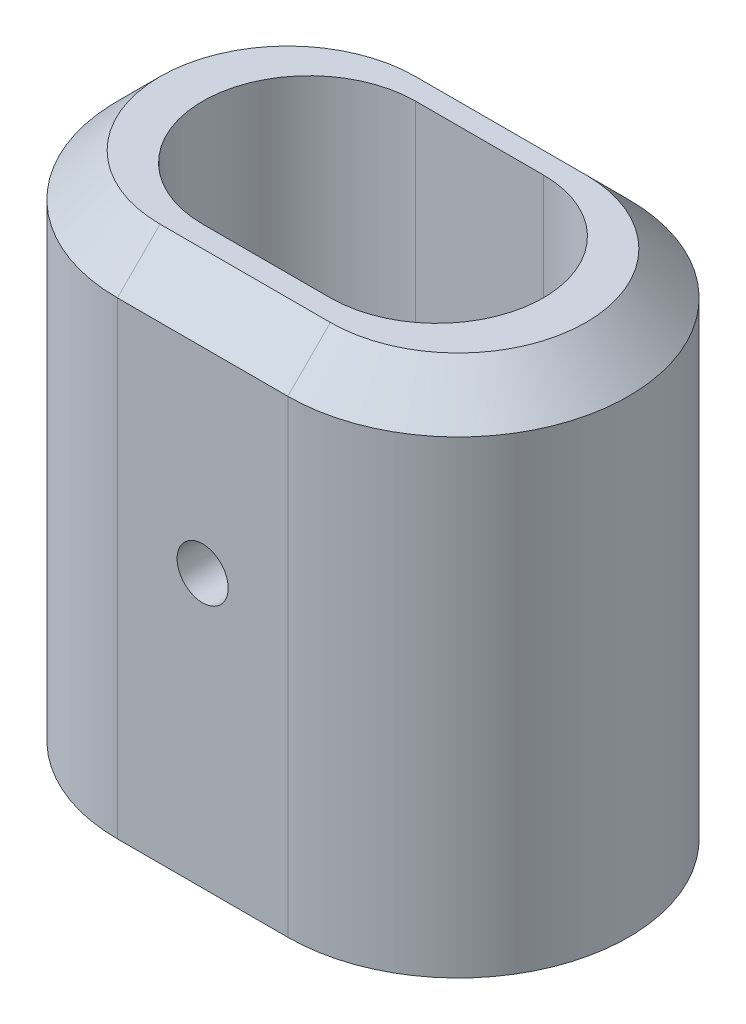
ISO-10303-21;
HEADER;
FILE_DESCRIPTION(('STEP AP214'),'2;1');
FILE_NAME('part.step','',(''),(''),'','','');
FILE_SCHEMA(('AUTOMOTIVE_DESIGN { 1 0 10303 214 1 1 1 1 }'));
ENDSEC;
DATA;
#1=APPLICATION_CONTEXT('core data for automotive mechanical design processes');
#2=APPLICATION_PROTOCOL_DEFINITION('international standard','automotive_design',2000,#1);
#3=PRODUCT_CONTEXT('',#1,'mechanical');
#4=PRODUCT('Part','Part','',(#3));
#5=PRODUCT_RELATED_PRODUCT_CATEGORY('part','',(#4));
#6=PRODUCT_DEFINITION_FORMATION('','',#4);
#7=PRODUCT_DEFINITION_CONTEXT('part definition',#1,'design');
#8=PRODUCT_DEFINITION('design','',#6,#7);
#9=PRODUCT_DEFINITION_SHAPE('','',#8);
#10=(LENGTH_UNIT() NAMED_UNIT(*) SI_UNIT(.MILLI.,.METRE.));
#11=(NAMED_UNIT(*) PLANE_ANGLE_UNIT() SI_UNIT($,.RADIAN.));
#12=(NAMED_UNIT(*) SI_UNIT($,.STERADIAN.) SOLID_ANGLE_UNIT());
#13=UNCERTAINTY_MEASURE_WITH_UNIT(LENGTH_MEASURE(1.E-05),#10,'distance_accuracy_value','');
#14=(GEOMETRIC_REPRESENTATION_CONTEXT(3) GLOBAL_UNCERTAINTY_ASSIGNED_CONTEXT((#13)) GLOBAL_UNIT_ASSIGNED_CONTEXT((#10,
#11,#12)) REPRESENTATION_CONTEXT('',''));
#15=CARTESIAN_POINT('',(0.,0.,0.));
#16=DIRECTION('',(0.,0.,1.));
#17=DIRECTION('',(1.,0.,0.));
#18=AXIS2_PLACEMENT_3D('',#15,#16,#17);
#19=CARTESIAN_POINT('',(0.,60.,0.));
#20=DIRECTION('',(0.,-1.,0.));
#21=DIRECTION('',(0.,0.,-1.));
#22=AXIS2_PLACEMENT_3D('',#19,#20,#21);
#23=CYLINDRICAL_SURFACE('',#22,20.);
#24=DIRECTION('',(0.,-1.,0.));
#25=VECTOR('',#24,1.);
#26=CARTESIAN_POINT('',(0.,60.,20.));
#27=LINE('',#26,#25);
#28=CARTESIAN_POINT('',(0.,55.,20.));
#29=VERTEX_POINT('',#28);
#30=CARTESIAN_POINT('',(0.,0.,20.));
#31=VERTEX_POINT('',#30);
#32=EDGE_CURVE('E170',#29,#31,#27,.T.);
#33=ORIENTED_EDGE('',*,*,#32,.F.);
#34=CARTESIAN_POINT('',(0.,55.,0.));
#35=DIRECTION('',(0.,1.,0.));
#36=DIRECTION('',(0.,0.,1.));
#37=AXIS2_PLACEMENT_3D('',#34,#35,#36);
#38=CIRCLE('',#37,20.);
#39=CARTESIAN_POINT('',(0.,55.,-20.));
#40=VERTEX_POINT('',#39);
#41=EDGE_CURVE('E11',#29,#40,#38,.F.);
#42=ORIENTED_EDGE('',*,*,#41,.T.);
#43=DIRECTION('',(0.,-1.,0.));
#44=VECTOR('',#43,1.);
#45=CARTESIAN_POINT('',(0.,60.,-20.));
#46=LINE('',#45,#44);
#47=CARTESIAN_POINT('',(0.,0.,-20.));
#48=VERTEX_POINT('',#47);
#49=EDGE_CURVE('E164',#40,#48,#46,.T.);
#50=ORIENTED_EDGE('',*,*,#49,.T.);
#51=CARTESIAN_POINT('',(0.,0.,0.));
#52=DIRECTION('',(0.,1.,0.));
#53=DIRECTION('',(0.,0.,1.));
#54=AXIS2_PLACEMENT_3D('',#51,#52,#53);
#55=CIRCLE('',#54,20.);
#56=EDGE_CURVE('E151',#48,#31,#55,.T.);
#57=ORIENTED_EDGE('',*,*,#56,.T.);
#58=EDGE_LOOP('',(#33,#42,#50,#57));
#59=FACE_BOUND('',#58,.T.);
#60=ADVANCED_FACE('F33',(#59),#23,.T.);
#61=CARTESIAN_POINT('',(0.,60.,20.));
#62=DIRECTION('',(0.,0.,-1.));
#63=DIRECTION('',(-1.,0.,0.));
#64=AXIS2_PLACEMENT_3D('',#61,#62,#63);
#65=PLANE('',#64);
#66=CARTESIAN_POINT('',(10.,32.,20.));
#67=DIRECTION('',(0.,0.,1.));
#68=DIRECTION('',(1.,0.,0.));
#69=AXIS2_PLACEMENT_3D('',#66,#67,#68);
#70=CIRCLE('',#69,3.);
#71=CARTESIAN_POINT('',(13.,32.,20.));
#72=VERTEX_POINT('',#71);
#73=EDGE_CURVE('E347',#72,#72,#70,.T.);
#74=ORIENTED_EDGE('',*,*,#73,.F.);
#75=EDGE_LOOP('',(#74));
#76=FACE_BOUND('',#75,.T.);
#77=DIRECTION('',(0.,-1.,0.));
#78=VECTOR('',#77,1.);
#79=CARTESIAN_POINT('',(20.,60.,20.));
#80=LINE('',#79,#78);
#81=CARTESIAN_POINT('',(20.,55.,20.));
#82=VERTEX_POINT('',#81);
#83=CARTESIAN_POINT('',(20.,0.,20.));
#84=VERTEX_POINT('',#83);
#85=EDGE_CURVE('E168',#82,#84,#80,.T.);
#86=ORIENTED_EDGE('',*,*,#85,.F.);
#87=DIRECTION('',(-1.,0.,0.));
#88=VECTOR('',#87,1.);
#89=CARTESIAN_POINT('',(0.,55.,20.));
#90=LINE('',#89,#88);
#91=EDGE_CURVE('E42',#82,#29,#90,.T.);
#92=ORIENTED_EDGE('',*,*,#91,.T.);
#93=ORIENTED_EDGE('',*,*,#32,.T.);
#94=DIRECTION('',(1.,0.,0.));
#95=VECTOR('',#94,1.);
#96=CARTESIAN_POINT('',(0.,0.,20.));
#97=LINE('',#96,#95);
#98=EDGE_CURVE('E154',#31,#84,#97,.T.);
#99=ORIENTED_EDGE('',*,*,#98,.T.);
#100=EDGE_LOOP('',(#86,#92,#93,#99));
#101=FACE_BOUND('',#100,.T.);
#102=ADVANCED_FACE('F207',(#76,#101),#65,.F.);
#103=CARTESIAN_POINT('',(20.,60.,0.));
#104=DIRECTION('',(0.,-1.,0.));
#105=DIRECTION('',(0.,0.,-1.));
#106=AXIS2_PLACEMENT_3D('',#103,#104,#105);
#107=CYLINDRICAL_SURFACE('',#106,20.);
#108=DIRECTION('',(0.,-1.,0.));
#109=VECTOR('',#108,1.);
#110=CARTESIAN_POINT('',(20.,60.,-20.));
#111=LINE('',#110,#109);
#112=CARTESIAN_POINT('',(20.,55.,-20.));
#113=VERTEX_POINT('',#112);
#114=CARTESIAN_POINT('',(20.,0.,-20.));
#115=VERTEX_POINT('',#114);
#116=EDGE_CURVE('E166',#113,#115,#111,.T.);
#117=ORIENTED_EDGE('',*,*,#116,.F.);
#118=CARTESIAN_POINT('',(20.,55.,0.));
#119=DIRECTION('',(0.,1.,0.));
#120=DIRECTION('',(0.,0.,1.));
#121=AXIS2_PLACEMENT_3D('',#118,#119,#120);
#122=CIRCLE('',#121,20.);
#123=EDGE_CURVE('E184',#113,#82,#122,.F.);
#124=ORIENTED_EDGE('',*,*,#123,.T.);
#125=ORIENTED_EDGE('',*,*,#85,.T.);
#126=CARTESIAN_POINT('',(20.,0.,0.));
#127=DIRECTION('',(0.,1.,0.));
#128=DIRECTION('',(0.,0.,1.));
#129=AXIS2_PLACEMENT_3D('',#126,#127,#128);
#130=CIRCLE('',#129,20.);
#131=EDGE_CURVE('E158',#84,#115,#130,.T.);
#132=ORIENTED_EDGE('',*,*,#131,.T.);
#133=EDGE_LOOP('',(#117,#124,#125,#132));
#134=FACE_BOUND('',#133,.T.);
#135=ADVANCED_FACE('F216',(#134),#107,.T.);
#136=CARTESIAN_POINT('',(0.,60.,-20.));
#137=DIRECTION('',(0.,0.,1.));
#138=DIRECTION('',(1.,0.,0.));
#139=AXIS2_PLACEMENT_3D('',#136,#137,#138);
#140=PLANE('',#139);
#141=CARTESIAN_POINT('',(10.,32.,-20.));
#142=DIRECTION('',(0.,0.,1.));
#143=DIRECTION('',(1.,0.,0.));
#144=AXIS2_PLACEMENT_3D('',#141,#142,#143);
#145=CIRCLE('',#144,3.);
#146=CARTESIAN_POINT('',(13.,32.,-20.));
#147=VERTEX_POINT('',#146);
#148=EDGE_CURVE('E135',#147,#147,#145,.T.);
#149=ORIENTED_EDGE('',*,*,#148,.T.);
#150=EDGE_LOOP('',(#149));
#151=FACE_BOUND('',#150,.T.);
#152=ORIENTED_EDGE('',*,*,#49,.F.);
#153=DIRECTION('',(1.,0.,0.));
#154=VECTOR('',#153,1.);
#155=CARTESIAN_POINT('',(20.,55.,-20.));
#156=LINE('',#155,#154);
#157=EDGE_CURVE('E181',#40,#113,#156,.T.);
#158=ORIENTED_EDGE('',*,*,#157,.T.);
#159=ORIENTED_EDGE('',*,*,#116,.T.);
#160=DIRECTION('',(-1.,0.,0.));
#161=VECTOR('',#160,1.);
#162=CARTESIAN_POINT('',(0.,0.,-20.));
#163=LINE('',#162,#161);
#164=EDGE_CURVE('E161',#115,#48,#163,.T.);
#165=ORIENTED_EDGE('',*,*,#164,.T.);
#166=EDGE_LOOP('',(#152,#158,#159,#165));
#167=FACE_BOUND('',#166,.T.);
#168=ADVANCED_FACE('F218',(#151,#167),#140,.F.);
#169=CARTESIAN_POINT('',(0.,60.,0.));
#170=DIRECTION('',(0.,1.,0.));
#171=DIRECTION('',(0.,0.,1.));
#172=AXIS2_PLACEMENT_3D('',#169,#170,#171);
#173=PLANE('',#172);
#174=CARTESIAN_POINT('',(2.5,60.,0.));
#175=DIRECTION('',(0.,1.,0.));
#176=DIRECTION('',(0.,0.,1.));
#177=AXIS2_PLACEMENT_3D('',#174,#175,#176);
#178=CIRCLE('',#177,12.5);
#179=CARTESIAN_POINT('',(2.5,60.,-12.5));
#180=VERTEX_POINT('',#179);
#181=CARTESIAN_POINT('',(2.5,60.,12.5));
#182=VERTEX_POINT('',#181);
#183=EDGE_CURVE('E50',#180,#182,#178,.T.);
#184=ORIENTED_EDGE('',*,*,#183,.F.);
#185=DIRECTION('',(1.,0.,0.));
#186=VECTOR('',#185,1.);
#187=CARTESIAN_POINT('',(0.,60.,-12.5));
#188=LINE('',#187,#186);
#189=CARTESIAN_POINT('',(17.5,60.,-12.5));
#190=VERTEX_POINT('',#189);
#191=EDGE_CURVE('E129',#180,#190,#188,.T.);
#192=ORIENTED_EDGE('',*,*,#191,.T.);
#193=CARTESIAN_POINT('',(17.5,60.,0.));
#194=DIRECTION('',(0.,1.,0.));
#195=DIRECTION('',(0.,0.,1.));
#196=AXIS2_PLACEMENT_3D('',#193,#194,#195);
#197=CIRCLE('',#196,12.5);
#198=CARTESIAN_POINT('',(17.5,60.,12.5));
#199=VERTEX_POINT('',#198);
#200=EDGE_CURVE('E132',#199,#190,#197,.T.);
#201=ORIENTED_EDGE('',*,*,#200,.F.);
#202=DIRECTION('',(1.,0.,0.));
#203=VECTOR('',#202,1.);
#204=CARTESIAN_POINT('',(0.,60.,12.5));
#205=LINE('',#204,#203);
#206=EDGE_CURVE('E141',#182,#199,#205,.T.);
#207=ORIENTED_EDGE('',*,*,#206,.F.);
#208=EDGE_LOOP('',(#184,#192,#201,#207));
#209=FACE_BOUND('',#208,.T.);
#210=CARTESIAN_POINT('',(20.,60.,0.));
#211=DIRECTION('',(0.,1.,0.));
#212=DIRECTION('',(0.,0.,1.));
#213=AXIS2_PLACEMENT_3D('',#210,#211,#212);
#214=CIRCLE('',#213,15.);
#215=CARTESIAN_POINT('',(20.,60.,15.));
#216=VERTEX_POINT('',#215);
#217=CARTESIAN_POINT('',(20.,60.,-15.));
#218=VERTEX_POINT('',#217);
#219=EDGE_CURVE('E176',#216,#218,#214,.T.);
#220=ORIENTED_EDGE('',*,*,#219,.T.);
#221=DIRECTION('',(-1.,0.,0.));
#222=VECTOR('',#221,1.);
#223=CARTESIAN_POINT('',(0.,60.,-15.));
#224=LINE('',#223,#222);
#225=CARTESIAN_POINT('',(0.,60.,-15.));
#226=VERTEX_POINT('',#225);
#227=EDGE_CURVE('E178',#218,#226,#224,.T.);
#228=ORIENTED_EDGE('',*,*,#227,.T.);
#229=CARTESIAN_POINT('',(0.,60.,0.));
#230=DIRECTION('',(0.,1.,0.));
#231=DIRECTION('',(0.,0.,1.));
#232=AXIS2_PLACEMENT_3D('',#229,#230,#231);
#233=CIRCLE('',#232,15.);
#234=CARTESIAN_POINT('',(0.,60.,15.));
#235=VERTEX_POINT('',#234);
#236=EDGE_CURVE('E172',#226,#235,#233,.T.);
#237=ORIENTED_EDGE('',*,*,#236,.T.);
#238=DIRECTION('',(1.,0.,0.));
#239=VECTOR('',#238,1.);
#240=CARTESIAN_POINT('',(20.,60.,15.));
#241=LINE('',#240,#239);
#242=EDGE_CURVE('E174',#235,#216,#241,.T.);
#243=ORIENTED_EDGE('',*,*,#242,.T.);
#244=EDGE_LOOP('',(#220,#228,#237,#243));
#245=FACE_BOUND('',#244,.T.);
#246=ADVANCED_FACE('F228',(#209,#245),#173,.T.);
#247=CARTESIAN_POINT('',(0.,0.,0.));
#248=DIRECTION('',(0.,1.,0.));
#249=DIRECTION('',(0.,0.,1.));
#250=AXIS2_PLACEMENT_3D('',#247,#248,#249);
#251=PLANE('',#250);
#252=DIRECTION('',(1.,0.,0.));
#253=VECTOR('',#252,1.);
#254=CARTESIAN_POINT('',(0.,0.,-12.5));
#255=LINE('',#254,#253);
#256=CARTESIAN_POINT('',(2.5,0.,-12.5));
#257=VERTEX_POINT('',#256);
#258=CARTESIAN_POINT('',(17.5,0.,-12.5));
#259=VERTEX_POINT('',#258);
#260=EDGE_CURVE('E120',#257,#259,#255,.T.);
#261=ORIENTED_EDGE('',*,*,#260,.F.);
#262=CARTESIAN_POINT('',(2.5,0.,0.));
#263=DIRECTION('',(0.,1.,0.));
#264=DIRECTION('',(0.,0.,1.));
#265=AXIS2_PLACEMENT_3D('',#262,#263,#264);
#266=CIRCLE('',#265,12.5);
#267=CARTESIAN_POINT('',(2.5,0.,12.5));
#268=VERTEX_POINT('',#267);
#269=EDGE_CURVE('E114',#257,#268,#266,.T.);
#270=ORIENTED_EDGE('',*,*,#269,.T.);
#271=DIRECTION('',(1.,0.,0.));
#272=VECTOR('',#271,1.);
#273=CARTESIAN_POINT('',(0.,0.,12.5));
#274=LINE('',#273,#272);
#275=CARTESIAN_POINT('',(17.5,0.,12.5));
#276=VERTEX_POINT('',#275);
#277=EDGE_CURVE('E123',#268,#276,#274,.T.);
#278=ORIENTED_EDGE('',*,*,#277,.T.);
#279=CARTESIAN_POINT('',(17.5,0.,0.));
#280=DIRECTION('',(0.,1.,0.));
#281=DIRECTION('',(0.,0.,1.));
#282=AXIS2_PLACEMENT_3D('',#279,#280,#281);
#283=CIRCLE('',#282,12.5);
#284=EDGE_CURVE('E58',#276,#259,#283,.T.);
#285=ORIENTED_EDGE('',*,*,#284,.T.);
#286=EDGE_LOOP('',(#261,#270,#278,#285));
#287=FACE_BOUND('',#286,.T.);
#288=ORIENTED_EDGE('',*,*,#56,.F.);
#289=ORIENTED_EDGE('',*,*,#164,.F.);
#290=ORIENTED_EDGE('',*,*,#131,.F.);
#291=ORIENTED_EDGE('',*,*,#98,.F.);
#292=EDGE_LOOP('',(#288,#289,#290,#291));
#293=FACE_BOUND('',#292,.T.);
#294=ADVANCED_FACE('F127',(#287,#293),#251,.F.);
#295=CARTESIAN_POINT('',(0.,60.,15.));
#296=DIRECTION('',(0.,0.707106781186545,0.70710678118655));
#297=DIRECTION('',(-1.,0.,0.));
#298=AXIS2_PLACEMENT_3D('',#295,#296,#297);
#299=PLANE('',#298);
#300=DIRECTION('',(0.,0.70710678118655,-0.707106781186545));
#301=VECTOR('',#300,1.);
#302=CARTESIAN_POINT('',(0.,55.,20.));
#303=LINE('',#302,#301);
#304=EDGE_CURVE('E190',#29,#235,#303,.T.);
#305=ORIENTED_EDGE('',*,*,#304,.F.);
#306=ORIENTED_EDGE('',*,*,#91,.F.);
#307=DIRECTION('',(0.,-0.70710678118655,0.707106781186545));
#308=VECTOR('',#307,1.);
#309=CARTESIAN_POINT('',(20.,60.,15.));
#310=LINE('',#309,#308);
#311=EDGE_CURVE('E155',#216,#82,#310,.T.);
#312=ORIENTED_EDGE('',*,*,#311,.F.);
#313=ORIENTED_EDGE('',*,*,#242,.F.);
#314=EDGE_LOOP('',(#305,#306,#312,#313));
#315=FACE_BOUND('',#314,.T.);
#316=ADVANCED_FACE('F35',(#315),#299,.T.);
#317=CARTESIAN_POINT('',(20.,60.,0.));
#318=DIRECTION('',(0.,-1.,0.));
#319=DIRECTION('',(0.,0.,-1.));
#320=AXIS2_PLACEMENT_3D('',#317,#318,#319);
#321=CONICAL_SURFACE('',#320,15.,0.785398163397445);
#322=ORIENTED_EDGE('',*,*,#311,.T.);
#323=ORIENTED_EDGE('',*,*,#123,.F.);
#324=DIRECTION('',(0.,-0.70710678118655,-0.707106781186545));
#325=VECTOR('',#324,1.);
#326=CARTESIAN_POINT('',(20.,60.,-15.));
#327=LINE('',#326,#325);
#328=EDGE_CURVE('E188',#218,#113,#327,.T.);
#329=ORIENTED_EDGE('',*,*,#328,.F.);
#330=ORIENTED_EDGE('',*,*,#219,.F.);
#331=EDGE_LOOP('',(#322,#323,#329,#330));
#332=FACE_BOUND('',#331,.T.);
#333=ADVANCED_FACE('F197',(#332),#321,.T.);
#334=CARTESIAN_POINT('',(0.,60.,0.));
#335=DIRECTION('',(0.,-1.,0.));
#336=DIRECTION('',(0.,0.,-1.));
#337=AXIS2_PLACEMENT_3D('',#334,#335,#336);
#338=CONICAL_SURFACE('',#337,15.,0.785398163397445);
#339=ORIENTED_EDGE('',*,*,#304,.T.);
#340=ORIENTED_EDGE('',*,*,#236,.F.);
#341=DIRECTION('',(0.,0.70710678118655,0.707106781186545));
#342=VECTOR('',#341,1.);
#343=CARTESIAN_POINT('',(0.,55.,-20.));
#344=LINE('',#343,#342);
#345=EDGE_CURVE('E147',#40,#226,#344,.T.);
#346=ORIENTED_EDGE('',*,*,#345,.F.);
#347=ORIENTED_EDGE('',*,*,#41,.F.);
#348=EDGE_LOOP('',(#339,#340,#346,#347));
#349=FACE_BOUND('',#348,.T.);
#350=ADVANCED_FACE('F226',(#349),#338,.T.);
#351=CARTESIAN_POINT('',(0.,60.,-15.));
#352=DIRECTION('',(0.,0.707106781186545,-0.70710678118655));
#353=DIRECTION('',(1.,0.,0.));
#354=AXIS2_PLACEMENT_3D('',#351,#352,#353);
#355=PLANE('',#354);
#356=ORIENTED_EDGE('',*,*,#328,.T.);
#357=ORIENTED_EDGE('',*,*,#157,.F.);
#358=ORIENTED_EDGE('',*,*,#345,.T.);
#359=ORIENTED_EDGE('',*,*,#227,.F.);
#360=EDGE_LOOP('',(#356,#357,#358,#359));
#361=FACE_BOUND('',#360,.T.);
#362=ADVANCED_FACE('F222',(#361),#355,.T.);
#363=CARTESIAN_POINT('',(2.5,0.,0.));
#364=DIRECTION('',(0.,1.,0.));
#365=DIRECTION('',(0.,0.,1.));
#366=AXIS2_PLACEMENT_3D('',#363,#364,#365);
#367=CYLINDRICAL_SURFACE('',#366,12.5);
#368=ORIENTED_EDGE('',*,*,#183,.T.);
#369=DIRECTION('',(0.,1.,0.));
#370=VECTOR('',#369,1.);
#371=CARTESIAN_POINT('',(2.5,0.,12.5));
#372=LINE('',#371,#370);
#373=EDGE_CURVE('E110',#268,#182,#372,.T.);
#374=ORIENTED_EDGE('',*,*,#373,.F.);
#375=ORIENTED_EDGE('',*,*,#269,.F.);
#376=DIRECTION('',(0.,1.,0.));
#377=VECTOR('',#376,1.);
#378=CARTESIAN_POINT('',(2.5,0.,-12.5));
#379=LINE('',#378,#377);
#380=EDGE_CURVE('E145',#257,#180,#379,.T.);
#381=ORIENTED_EDGE('',*,*,#380,.T.);
#382=EDGE_LOOP('',(#368,#374,#375,#381));
#383=FACE_BOUND('',#382,.T.);
#384=ADVANCED_FACE('F112',(#383),#367,.F.);
#385=CARTESIAN_POINT('',(0.,0.,-12.5));
#386=DIRECTION('',(0.,0.,1.));
#387=DIRECTION('',(1.,0.,0.));
#388=AXIS2_PLACEMENT_3D('',#385,#386,#387);
#389=PLANE('',#388);
#390=CARTESIAN_POINT('',(10.,32.,-12.5));
#391=DIRECTION('',(0.,0.,1.));
#392=DIRECTION('',(1.,0.,0.));
#393=AXIS2_PLACEMENT_3D('',#390,#391,#392);
#394=CIRCLE('',#393,3.);
#395=CARTESIAN_POINT('',(13.,32.,-12.5));
#396=VERTEX_POINT('',#395);
#397=EDGE_CURVE('E343',#396,#396,#394,.T.);
#398=ORIENTED_EDGE('',*,*,#397,.F.);
#399=EDGE_LOOP('',(#398));
#400=FACE_BOUND('',#399,.T.);
#401=ORIENTED_EDGE('',*,*,#191,.F.);
#402=ORIENTED_EDGE('',*,*,#380,.F.);
#403=ORIENTED_EDGE('',*,*,#260,.T.);
#404=DIRECTION('',(0.,1.,0.));
#405=VECTOR('',#404,1.);
#406=CARTESIAN_POINT('',(17.5,0.,-12.5));
#407=LINE('',#406,#405);
#408=EDGE_CURVE('E148',#259,#190,#407,.T.);
#409=ORIENTED_EDGE('',*,*,#408,.T.);
#410=EDGE_LOOP('',(#401,#402,#403,#409));
#411=FACE_BOUND('',#410,.T.);
#412=ADVANCED_FACE('F275',(#400,#411),#389,.T.);
#413=CARTESIAN_POINT('',(17.5,0.,0.));
#414=DIRECTION('',(0.,1.,0.));
#415=DIRECTION('',(0.,0.,1.));
#416=AXIS2_PLACEMENT_3D('',#413,#414,#415);
#417=CYLINDRICAL_SURFACE('',#416,12.5);
#418=ORIENTED_EDGE('',*,*,#200,.T.);
#419=ORIENTED_EDGE('',*,*,#408,.F.);
#420=ORIENTED_EDGE('',*,*,#284,.F.);
#421=DIRECTION('',(0.,1.,0.));
#422=VECTOR('',#421,1.);
#423=CARTESIAN_POINT('',(17.5,0.,12.5));
#424=LINE('',#423,#422);
#425=EDGE_CURVE('E119',#276,#199,#424,.T.);
#426=ORIENTED_EDGE('',*,*,#425,.T.);
#427=EDGE_LOOP('',(#418,#419,#420,#426));
#428=FACE_BOUND('',#427,.T.);
#429=ADVANCED_FACE('F282',(#428),#417,.F.);
#430=CARTESIAN_POINT('',(0.,0.,12.5));
#431=DIRECTION('',(0.,0.,1.));
#432=DIRECTION('',(1.,0.,0.));
#433=AXIS2_PLACEMENT_3D('',#430,#431,#432);
#434=PLANE('',#433);
#435=CARTESIAN_POINT('',(10.,32.,12.5));
#436=DIRECTION('',(0.,0.,1.));
#437=DIRECTION('',(1.,0.,0.));
#438=AXIS2_PLACEMENT_3D('',#435,#436,#437);
#439=CIRCLE('',#438,3.);
#440=CARTESIAN_POINT('',(13.,32.,12.5));
#441=VERTEX_POINT('',#440);
#442=EDGE_CURVE('E37',#441,#441,#439,.T.);
#443=ORIENTED_EDGE('',*,*,#442,.T.);
#444=EDGE_LOOP('',(#443));
#445=FACE_BOUND('',#444,.T.);
#446=ORIENTED_EDGE('',*,*,#206,.T.);
#447=ORIENTED_EDGE('',*,*,#425,.F.);
#448=ORIENTED_EDGE('',*,*,#277,.F.);
#449=ORIENTED_EDGE('',*,*,#373,.T.);
#450=EDGE_LOOP('',(#446,#447,#448,#449));
#451=FACE_BOUND('',#450,.T.);
#452=ADVANCED_FACE('F124',(#445,#451),#434,.F.);
#453=CARTESIAN_POINT('',(10.,32.,-40.));
#454=DIRECTION('',(0.,0.,1.));
#455=DIRECTION('',(1.,0.,0.));
#456=AXIS2_PLACEMENT_3D('',#453,#454,#455);
#457=CYLINDRICAL_SURFACE('',#456,3.);
#458=ORIENTED_EDGE('',*,*,#73,.T.);
#459=EDGE_LOOP('',(#458));
#460=FACE_BOUND('',#459,.T.);
#461=ORIENTED_EDGE('',*,*,#442,.F.);
#462=EDGE_LOOP('',(#461));
#463=FACE_BOUND('',#462,.T.);
#464=ADVANCED_FACE('F317',(#460,#463),#457,.F.);
#465=ORIENTED_EDGE('',*,*,#397,.T.);
#466=EDGE_LOOP('',(#465));
#467=FACE_BOUND('',#466,.T.);
#468=ORIENTED_EDGE('',*,*,#148,.F.);
#469=EDGE_LOOP('',(#468));
#470=FACE_BOUND('',#469,.T.);
#471=ADVANCED_FACE('F327',(#467,#470),#457,.F.);
#472=CLOSED_SHELL('',(#60,#102,#135,#168,#246,#294,#316,#333,#350,#362,#384,#412,#429,#452,#464,#471));
#473=MANIFOLD_SOLID_BREP('B2',#472);
#474=ADVANCED_BREP_SHAPE_REPRESENTATION('',(#18,#473),#14);
#475=SHAPE_DEFINITION_REPRESENTATION(#9,#474);
ENDSEC;
END-ISO-10303-21;
